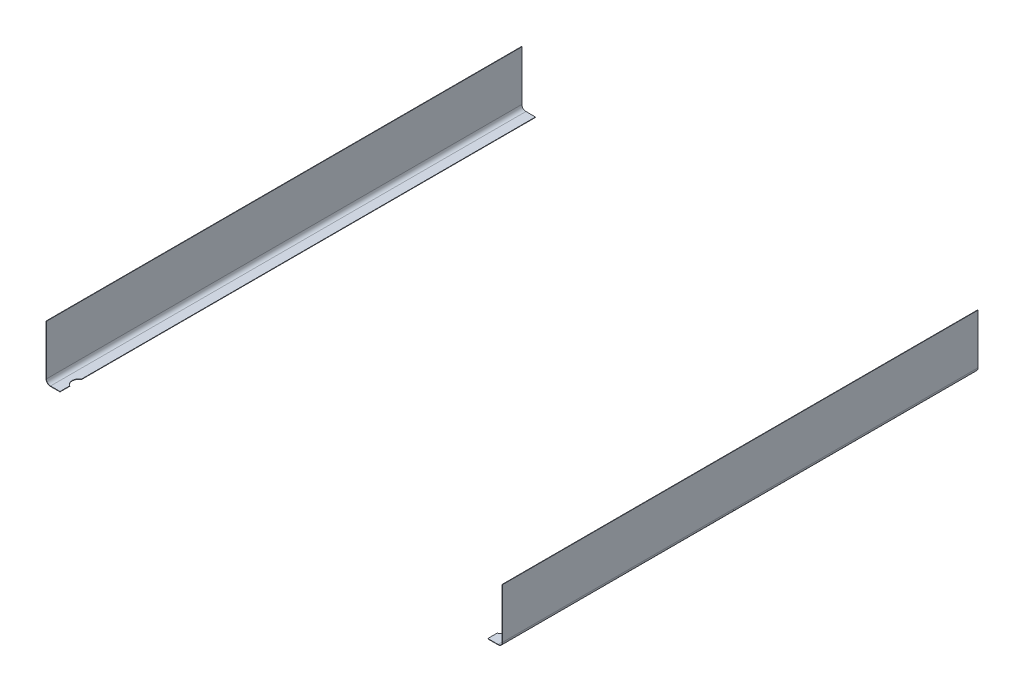
ISO-10303-21;
HEADER;
FILE_DESCRIPTION(('STEP AP214'),'2;1');
FILE_NAME('part.step','',(''),(''),'','','');
FILE_SCHEMA(('AUTOMOTIVE_DESIGN { 1 0 10303 214 1 1 1 1 }'));
ENDSEC;
DATA;
#1=APPLICATION_CONTEXT('core data for automotive mechanical design processes');
#2=APPLICATION_PROTOCOL_DEFINITION('international standard','automotive_design',2000,#1);
#3=PRODUCT_CONTEXT('',#1,'mechanical');
#4=PRODUCT('Part','Part','',(#3));
#5=PRODUCT_RELATED_PRODUCT_CATEGORY('part','',(#4));
#6=PRODUCT_DEFINITION_FORMATION('','',#4);
#7=PRODUCT_DEFINITION_CONTEXT('part definition',#1,'design');
#8=PRODUCT_DEFINITION('design','',#6,#7);
#9=PRODUCT_DEFINITION_SHAPE('','',#8);
#10=(LENGTH_UNIT() NAMED_UNIT(*) SI_UNIT(.MILLI.,.METRE.));
#11=(NAMED_UNIT(*) PLANE_ANGLE_UNIT() SI_UNIT($,.RADIAN.));
#12=(NAMED_UNIT(*) SI_UNIT($,.STERADIAN.) SOLID_ANGLE_UNIT());
#13=UNCERTAINTY_MEASURE_WITH_UNIT(LENGTH_MEASURE(1.E-05),#10,'distance_accuracy_value','');
#14=(GEOMETRIC_REPRESENTATION_CONTEXT(3) GLOBAL_UNCERTAINTY_ASSIGNED_CONTEXT((#13)) GLOBAL_UNIT_ASSIGNED_CONTEXT((#10,
#11,#12)) REPRESENTATION_CONTEXT('',''));
#15=CARTESIAN_POINT('',(0.,0.,0.));
#16=DIRECTION('',(0.,0.,1.));
#17=DIRECTION('',(1.,0.,0.));
#18=AXIS2_PLACEMENT_3D('',#15,#16,#17);
#19=CARTESIAN_POINT('',(-400.04999999999,100.838,-424.18762));
#20=DIRECTION('',(-1.,0.,0.));
#21=DIRECTION('',(0.,0.,1.));
#22=AXIS2_PLACEMENT_3D('',#19,#20,#21);
#23=PLANE('',#22);
#24=DIRECTION('',(0.,-1.,0.));
#25=VECTOR('',#24,1.);
#26=CARTESIAN_POINT('',(-400.04999999999,100.838,463.55));
#27=LINE('',#26,#25);
#28=CARTESIAN_POINT('',(-400.04999999999,0.,463.55));
#29=VERTEX_POINT('',#28);
#30=CARTESIAN_POINT('',(-400.04999999999,-0.762,463.55));
#31=VERTEX_POINT('',#30);
#32=EDGE_CURVE('P0_E235',#29,#31,#27,.T.);
#33=ORIENTED_EDGE('',*,*,#32,.T.);
#34=DIRECTION('',(0.,0.,-1.));
#35=VECTOR('',#34,1.);
#36=CARTESIAN_POINT('',(-400.04999999999,-0.762,-424.18762));
#37=LINE('',#36,#35);
#38=CARTESIAN_POINT('',(-400.04999999999,-0.762,445.338522628068));
#39=VERTEX_POINT('',#38);
#40=EDGE_CURVE('P0_E25',#31,#39,#37,.T.);
#41=ORIENTED_EDGE('',*,*,#40,.T.);
#42=DIRECTION('',(0.,-1.,0.));
#43=VECTOR('',#42,1.);
#44=CARTESIAN_POINT('',(-400.04999999999,0.508,445.338522628068));
#45=LINE('',#44,#43);
#46=CARTESIAN_POINT('',(-400.04999999999,0.,445.338522628068));
#47=VERTEX_POINT('',#46);
#48=EDGE_CURVE('P0_E231',#47,#39,#45,.T.);
#49=ORIENTED_EDGE('',*,*,#48,.F.);
#50=DIRECTION('',(0.,0.,-1.));
#51=VECTOR('',#50,1.);
#52=CARTESIAN_POINT('',(-400.04999999999,0.,0.));
#53=LINE('',#52,#51);
#54=EDGE_CURVE('P0_E48',#29,#47,#53,.T.);
#55=ORIENTED_EDGE('',*,*,#54,.F.);
#56=EDGE_LOOP('',(#33,#41,#49,#55));
#57=FACE_BOUND('',#56,.T.);
#58=ADVANCED_FACE('P0_F17',(#57),#23,.F.);
#59=CARTESIAN_POINT('',(-400.04999999999,100.838,-424.18762));
#60=DIRECTION('',(-1.,0.,0.));
#61=DIRECTION('',(0.,0.,1.));
#62=AXIS2_PLACEMENT_3D('',#59,#60,#61);
#63=PLANE('',#62);
#64=DIRECTION('',(0.,1.,0.));
#65=VECTOR('',#64,1.);
#66=CARTESIAN_POINT('',(-400.04999999999,0.508,423.341477371931));
#67=LINE('',#66,#65);
#68=CARTESIAN_POINT('',(-400.04999999999,-0.762,423.341477371931));
#69=VERTEX_POINT('',#68);
#70=CARTESIAN_POINT('',(-400.04999999999,0.,423.341477371931));
#71=VERTEX_POINT('',#70);
#72=EDGE_CURVE('P0_E223',#69,#71,#67,.T.);
#73=ORIENTED_EDGE('',*,*,#72,.F.);
#74=DIRECTION('',(0.,0.,-1.));
#75=VECTOR('',#74,1.);
#76=CARTESIAN_POINT('',(-400.04999999999,-0.762,-424.18762));
#77=LINE('',#76,#75);
#78=CARTESIAN_POINT('',(-400.04999999999,-0.762,-424.18762));
#79=VERTEX_POINT('',#78);
#80=EDGE_CURVE('P0_E11',#69,#79,#77,.T.);
#81=ORIENTED_EDGE('',*,*,#80,.T.);
#82=DIRECTION('',(0.,-1.,0.));
#83=VECTOR('',#82,1.);
#84=CARTESIAN_POINT('',(-400.04999999999,0.508,-424.18762));
#85=LINE('',#84,#83);
#86=CARTESIAN_POINT('',(-400.04999999999,0.,-424.18762));
#87=VERTEX_POINT('',#86);
#88=EDGE_CURVE('P0_E211',#87,#79,#85,.T.);
#89=ORIENTED_EDGE('',*,*,#88,.F.);
#90=DIRECTION('',(0.,0.,-1.));
#91=VECTOR('',#90,1.);
#92=CARTESIAN_POINT('',(-400.04999999999,0.,0.));
#93=LINE('',#92,#91);
#94=EDGE_CURVE('P0_E246',#71,#87,#93,.T.);
#95=ORIENTED_EDGE('',*,*,#94,.F.);
#96=EDGE_LOOP('',(#73,#81,#89,#95));
#97=FACE_BOUND('',#96,.T.);
#98=ADVANCED_FACE('P0_F259',(#97),#63,.F.);
#99=CARTESIAN_POINT('',(0.,-0.762,0.));
#100=DIRECTION('',(0.,-1.,0.));
#101=DIRECTION('',(0.,0.,-1.));
#102=AXIS2_PLACEMENT_3D('',#99,#100,#101);
#103=PLANE('',#102);
#104=ORIENTED_EDGE('',*,*,#40,.F.);
#105=DIRECTION('',(1.,0.,0.));
#106=VECTOR('',#105,1.);
#107=CARTESIAN_POINT('',(-426.212,-0.762,463.55));
#108=LINE('',#107,#106);
#109=CARTESIAN_POINT('',(-417.83,-0.762,463.55));
#110=VERTEX_POINT('',#109);
#111=EDGE_CURVE('P0_E241',#110,#31,#108,.T.);
#112=ORIENTED_EDGE('',*,*,#111,.F.);
#113=DIRECTION('',(0.,0.,1.));
#114=VECTOR('',#113,1.);
#115=CARTESIAN_POINT('',(-417.83,-0.762,-450.85));
#116=LINE('',#115,#114);
#117=CARTESIAN_POINT('',(-417.83,-0.762,-424.18762));
#118=VERTEX_POINT('',#117);
#119=EDGE_CURVE('P0_E141',#118,#110,#116,.T.);
#120=ORIENTED_EDGE('',*,*,#119,.F.);
#121=DIRECTION('',(1.,0.,0.));
#122=VECTOR('',#121,1.);
#123=CARTESIAN_POINT('',(0.,-0.762,-424.18762));
#124=LINE('',#123,#122);
#125=EDGE_CURVE('P0_E215',#118,#79,#124,.T.);
#126=ORIENTED_EDGE('',*,*,#125,.T.);
#127=ORIENTED_EDGE('',*,*,#80,.F.);
#128=CARTESIAN_POINT('',(-393.7,-0.762,434.34));
#129=DIRECTION('',(0.,-1.,0.));
#130=DIRECTION('',(0.,0.,-1.));
#131=AXIS2_PLACEMENT_3D('',#128,#129,#130);
#132=CIRCLE('',#131,12.7);
#133=EDGE_CURVE('P0_E219',#39,#69,#132,.T.);
#134=ORIENTED_EDGE('',*,*,#133,.F.);
#135=EDGE_LOOP('',(#104,#112,#120,#126,#127,#134));
#136=FACE_BOUND('',#135,.T.);
#137=ADVANCED_FACE('P0_F255',(#136),#103,.T.);
#138=CARTESIAN_POINT('',(0.,0.,0.));
#139=DIRECTION('',(0.,-1.,0.));
#140=DIRECTION('',(0.,0.,-1.));
#141=AXIS2_PLACEMENT_3D('',#138,#139,#140);
#142=PLANE('',#141);
#143=DIRECTION('',(1.,0.,0.));
#144=VECTOR('',#143,1.);
#145=CARTESIAN_POINT('',(-426.212,0.,463.55));
#146=LINE('',#145,#144);
#147=CARTESIAN_POINT('',(-417.83,0.,463.55));
#148=VERTEX_POINT('',#147);
#149=EDGE_CURVE('P0_E238',#148,#29,#146,.T.);
#150=ORIENTED_EDGE('',*,*,#149,.T.);
#151=ORIENTED_EDGE('',*,*,#54,.T.);
#152=CARTESIAN_POINT('',(-393.7,0.,434.34));
#153=DIRECTION('',(0.,-1.,0.));
#154=DIRECTION('',(0.,0.,-1.));
#155=AXIS2_PLACEMENT_3D('',#152,#153,#154);
#156=CIRCLE('',#155,12.7);
#157=EDGE_CURVE('P0_E227',#47,#71,#156,.T.);
#158=ORIENTED_EDGE('',*,*,#157,.T.);
#159=ORIENTED_EDGE('',*,*,#94,.T.);
#160=DIRECTION('',(1.,0.,0.));
#161=VECTOR('',#160,1.);
#162=CARTESIAN_POINT('',(0.,0.,-424.18762));
#163=LINE('',#162,#161);
#164=CARTESIAN_POINT('',(-417.83,0.,-424.18762));
#165=VERTEX_POINT('',#164);
#166=EDGE_CURVE('P0_E207',#165,#87,#163,.T.);
#167=ORIENTED_EDGE('',*,*,#166,.F.);
#168=DIRECTION('',(0.,0.,1.));
#169=VECTOR('',#168,1.);
#170=CARTESIAN_POINT('',(-417.83,0.,-450.85));
#171=LINE('',#170,#169);
#172=EDGE_CURVE('P0_E176',#165,#148,#171,.T.);
#173=ORIENTED_EDGE('',*,*,#172,.T.);
#174=EDGE_LOOP('',(#150,#151,#158,#159,#167,#173));
#175=FACE_BOUND('',#174,.T.);
#176=ADVANCED_FACE('P0_F261',(#175),#142,.F.);
#177=CARTESIAN_POINT('',(-426.212,-0.762,463.55));
#178=DIRECTION('',(0.,0.,1.));
#179=DIRECTION('',(1.,0.,0.));
#180=AXIS2_PLACEMENT_3D('',#177,#178,#179);
#181=PLANE('',#180);
#182=ORIENTED_EDGE('',*,*,#32,.F.);
#183=ORIENTED_EDGE('',*,*,#149,.F.);
#184=DIRECTION('',(0.,1.,0.));
#185=VECTOR('',#184,1.);
#186=CARTESIAN_POINT('',(-417.83,0.,463.55));
#187=LINE('',#186,#185);
#188=EDGE_CURVE('P0_E146',#110,#148,#187,.T.);
#189=ORIENTED_EDGE('',*,*,#188,.F.);
#190=ORIENTED_EDGE('',*,*,#111,.T.);
#191=EDGE_LOOP('',(#182,#183,#189,#190));
#192=FACE_BOUND('',#191,.T.);
#193=ADVANCED_FACE('P0_F264',(#192),#181,.T.);
#194=CARTESIAN_POINT('',(-393.7,0.508,434.34));
#195=DIRECTION('',(0.,-1.,0.));
#196=DIRECTION('',(0.,0.,-1.));
#197=AXIS2_PLACEMENT_3D('',#194,#195,#196);
#198=CYLINDRICAL_SURFACE('',#197,12.7);
#199=ORIENTED_EDGE('',*,*,#133,.T.);
#200=ORIENTED_EDGE('',*,*,#72,.T.);
#201=ORIENTED_EDGE('',*,*,#157,.F.);
#202=ORIENTED_EDGE('',*,*,#48,.T.);
#203=EDGE_LOOP('',(#199,#200,#201,#202));
#204=FACE_BOUND('',#203,.T.);
#205=ADVANCED_FACE('P0_F254',(#204),#198,.F.);
#206=CARTESIAN_POINT('',(-444.5,-103.378,-424.18762));
#207=DIRECTION('',(0.,0.,-1.));
#208=DIRECTION('',(0.,-1.,0.));
#209=AXIS2_PLACEMENT_3D('',#206,#207,#208);
#210=PLANE('',#209);
#211=DIRECTION('',(0.,1.,0.));
#212=VECTOR('',#211,1.);
#213=CARTESIAN_POINT('',(-425.45,0.,-424.18762));
#214=LINE('',#213,#212);
#215=CARTESIAN_POINT('',(-425.45,7.62,-424.18762));
#216=VERTEX_POINT('',#215);
#217=CARTESIAN_POINT('',(-425.45,100.838,-424.18762));
#218=VERTEX_POINT('',#217);
#219=EDGE_CURVE('P0_E204',#216,#218,#214,.T.);
#220=ORIENTED_EDGE('',*,*,#219,.F.);
#221=CARTESIAN_POINT('',(-417.83,7.62,-424.18762));
#222=DIRECTION('',(0.,0.,-1.));
#223=DIRECTION('',(-1.,0.,0.));
#224=AXIS2_PLACEMENT_3D('',#221,#222,#223);
#225=CIRCLE('',#224,7.62);
#226=EDGE_CURVE('P0_E172',#165,#216,#225,.T.);
#227=ORIENTED_EDGE('',*,*,#226,.F.);
#228=ORIENTED_EDGE('',*,*,#166,.T.);
#229=ORIENTED_EDGE('',*,*,#88,.T.);
#230=ORIENTED_EDGE('',*,*,#125,.F.);
#231=CARTESIAN_POINT('',(-417.83,7.62,-424.18762));
#232=DIRECTION('',(0.,0.,-1.));
#233=DIRECTION('',(-1.,0.,0.));
#234=AXIS2_PLACEMENT_3D('',#231,#232,#233);
#235=CIRCLE('',#234,8.382);
#236=CARTESIAN_POINT('',(-426.212,7.62,-424.18762));
#237=VERTEX_POINT('',#236);
#238=EDGE_CURVE('P0_E133',#118,#237,#235,.T.);
#239=ORIENTED_EDGE('',*,*,#238,.T.);
#240=DIRECTION('',(0.,1.,0.));
#241=VECTOR('',#240,1.);
#242=CARTESIAN_POINT('',(-426.212,0.,-424.18762));
#243=LINE('',#242,#241);
#244=CARTESIAN_POINT('',(-426.212,100.838,-424.18762));
#245=VERTEX_POINT('',#244);
#246=EDGE_CURVE('P0_E129',#237,#245,#243,.T.);
#247=ORIENTED_EDGE('',*,*,#246,.T.);
#248=DIRECTION('',(-1.,0.,0.));
#249=VECTOR('',#248,1.);
#250=CARTESIAN_POINT('',(-425.45,100.838,-424.18762));
#251=LINE('',#250,#249);
#252=EDGE_CURVE('P0_E189',#218,#245,#251,.T.);
#253=ORIENTED_EDGE('',*,*,#252,.F.);
#254=EDGE_LOOP('',(#220,#227,#228,#229,#230,#239,#247,#253));
#255=FACE_BOUND('',#254,.T.);
#256=ADVANCED_FACE('P0_F266',(#255),#210,.T.);
#257=CARTESIAN_POINT('',(-425.45,0.,-450.85));
#258=DIRECTION('',(1.,0.,0.));
#259=DIRECTION('',(0.,1.,0.));
#260=AXIS2_PLACEMENT_3D('',#257,#258,#259);
#261=PLANE('',#260);
#262=DIRECTION('',(0.,0.,1.));
#263=VECTOR('',#262,1.);
#264=CARTESIAN_POINT('',(-425.45,7.62,-450.85));
#265=LINE('',#264,#263);
#266=CARTESIAN_POINT('',(-425.45,7.62,463.55));
#267=VERTEX_POINT('',#266);
#268=EDGE_CURVE('P0_E175',#216,#267,#265,.T.);
#269=ORIENTED_EDGE('',*,*,#268,.F.);
#270=ORIENTED_EDGE('',*,*,#219,.T.);
#271=DIRECTION('',(0.,0.,1.));
#272=VECTOR('',#271,1.);
#273=CARTESIAN_POINT('',(-425.45,100.838,-450.85));
#274=LINE('',#273,#272);
#275=CARTESIAN_POINT('',(-425.45,100.838,463.55));
#276=VERTEX_POINT('',#275);
#277=EDGE_CURVE('P0_E170',#218,#276,#274,.T.);
#278=ORIENTED_EDGE('',*,*,#277,.T.);
#279=DIRECTION('',(0.,1.,0.));
#280=VECTOR('',#279,1.);
#281=CARTESIAN_POINT('',(-425.45,0.,463.55));
#282=LINE('',#281,#280);
#283=EDGE_CURVE('P0_E159',#267,#276,#282,.T.);
#284=ORIENTED_EDGE('',*,*,#283,.F.);
#285=EDGE_LOOP('',(#269,#270,#278,#284));
#286=FACE_BOUND('',#285,.T.);
#287=ADVANCED_FACE('P0_F273',(#286),#261,.T.);
#288=CARTESIAN_POINT('',(-417.83,7.62,-450.85));
#289=DIRECTION('',(0.,0.,1.));
#290=DIRECTION('',(1.,0.,0.));
#291=AXIS2_PLACEMENT_3D('',#288,#289,#290);
#292=CYLINDRICAL_SURFACE('',#291,7.62);
#293=ORIENTED_EDGE('',*,*,#172,.F.);
#294=ORIENTED_EDGE('',*,*,#226,.T.);
#295=ORIENTED_EDGE('',*,*,#268,.T.);
#296=CARTESIAN_POINT('',(-417.83,7.62,463.55));
#297=DIRECTION('',(0.,0.,-1.));
#298=DIRECTION('',(1.,0.,0.));
#299=AXIS2_PLACEMENT_3D('',#296,#297,#298);
#300=CIRCLE('',#299,7.62);
#301=EDGE_CURVE('P0_E154',#148,#267,#300,.T.);
#302=ORIENTED_EDGE('',*,*,#301,.F.);
#303=EDGE_LOOP('',(#293,#294,#295,#302));
#304=FACE_BOUND('',#303,.T.);
#305=ADVANCED_FACE('P0_F271',(#304),#292,.F.);
#306=CARTESIAN_POINT('',(-417.83,7.62,-450.85));
#307=DIRECTION('',(0.,0.,1.));
#308=DIRECTION('',(1.,0.,0.));
#309=AXIS2_PLACEMENT_3D('',#306,#307,#308);
#310=CYLINDRICAL_SURFACE('',#309,8.382);
#311=ORIENTED_EDGE('',*,*,#238,.F.);
#312=ORIENTED_EDGE('',*,*,#119,.T.);
#313=CARTESIAN_POINT('',(-417.83,7.62,463.55));
#314=DIRECTION('',(0.,0.,-1.));
#315=DIRECTION('',(1.,0.,0.));
#316=AXIS2_PLACEMENT_3D('',#313,#314,#315);
#317=CIRCLE('',#316,8.382);
#318=CARTESIAN_POINT('',(-426.212,7.62,463.55));
#319=VERTEX_POINT('',#318);
#320=EDGE_CURVE('P0_E137',#110,#319,#317,.T.);
#321=ORIENTED_EDGE('',*,*,#320,.T.);
#322=DIRECTION('',(0.,0.,1.));
#323=VECTOR('',#322,1.);
#324=CARTESIAN_POINT('',(-426.212,7.62,-450.85));
#325=LINE('',#324,#323);
#326=EDGE_CURVE('P0_E123',#237,#319,#325,.T.);
#327=ORIENTED_EDGE('',*,*,#326,.F.);
#328=EDGE_LOOP('',(#311,#312,#321,#327));
#329=FACE_BOUND('',#328,.T.);
#330=ADVANCED_FACE('P0_F139',(#329),#310,.T.);
#331=CARTESIAN_POINT('',(-426.212,0.,-450.85));
#332=DIRECTION('',(1.,0.,0.));
#333=DIRECTION('',(0.,1.,0.));
#334=AXIS2_PLACEMENT_3D('',#331,#332,#333);
#335=PLANE('',#334);
#336=ORIENTED_EDGE('',*,*,#246,.F.);
#337=ORIENTED_EDGE('',*,*,#326,.T.);
#338=DIRECTION('',(0.,1.,0.));
#339=VECTOR('',#338,1.);
#340=CARTESIAN_POINT('',(-426.212,0.,463.55));
#341=LINE('',#340,#339);
#342=CARTESIAN_POINT('',(-426.212,100.838,463.55));
#343=VERTEX_POINT('',#342);
#344=EDGE_CURVE('P0_E128',#319,#343,#341,.T.);
#345=ORIENTED_EDGE('',*,*,#344,.T.);
#346=DIRECTION('',(0.,0.,1.));
#347=VECTOR('',#346,1.);
#348=CARTESIAN_POINT('',(-426.212,100.838,-450.85));
#349=LINE('',#348,#347);
#350=EDGE_CURVE('P0_E193',#245,#343,#349,.T.);
#351=ORIENTED_EDGE('',*,*,#350,.F.);
#352=EDGE_LOOP('',(#336,#337,#345,#351));
#353=FACE_BOUND('',#352,.T.);
#354=ADVANCED_FACE('P0_F125',(#353),#335,.F.);
#355=CARTESIAN_POINT('',(-425.45,100.838,-450.85));
#356=DIRECTION('',(0.,1.,0.));
#357=DIRECTION('',(1.,0.,0.));
#358=AXIS2_PLACEMENT_3D('',#355,#356,#357);
#359=PLANE('',#358);
#360=ORIENTED_EDGE('',*,*,#277,.F.);
#361=ORIENTED_EDGE('',*,*,#252,.T.);
#362=ORIENTED_EDGE('',*,*,#350,.T.);
#363=DIRECTION('',(1.,0.,0.));
#364=VECTOR('',#363,1.);
#365=CARTESIAN_POINT('',(-425.45,100.838,463.55));
#366=LINE('',#365,#364);
#367=EDGE_CURVE('P0_E147',#343,#276,#366,.T.);
#368=ORIENTED_EDGE('',*,*,#367,.T.);
#369=EDGE_LOOP('',(#360,#361,#362,#368));
#370=FACE_BOUND('',#369,.T.);
#371=ADVANCED_FACE('P0_F277',(#370),#359,.T.);
#372=CARTESIAN_POINT('',(-417.83,7.62,463.55));
#373=DIRECTION('',(0.,0.,-1.));
#374=DIRECTION('',(0.,-1.,0.));
#375=AXIS2_PLACEMENT_3D('',#372,#373,#374);
#376=PLANE('',#375);
#377=DIRECTION('',(1.,0.,0.));
#378=VECTOR('',#377,1.);
#379=CARTESIAN_POINT('',(-425.45,7.62,463.55));
#380=LINE('',#379,#378);
#381=EDGE_CURVE('P0_E151',#319,#267,#380,.T.);
#382=ORIENTED_EDGE('',*,*,#381,.F.);
#383=ORIENTED_EDGE('',*,*,#320,.F.);
#384=ORIENTED_EDGE('',*,*,#188,.T.);
#385=ORIENTED_EDGE('',*,*,#301,.T.);
#386=EDGE_LOOP('',(#382,#383,#384,#385));
#387=FACE_BOUND('',#386,.T.);
#388=ADVANCED_FACE('P0_F152',(#387),#376,.F.);
#389=CARTESIAN_POINT('',(-425.45,0.,463.55));
#390=DIRECTION('',(0.,0.,-1.));
#391=DIRECTION('',(0.,-1.,0.));
#392=AXIS2_PLACEMENT_3D('',#389,#390,#391);
#393=PLANE('',#392);
#394=ORIENTED_EDGE('',*,*,#344,.F.);
#395=ORIENTED_EDGE('',*,*,#381,.T.);
#396=ORIENTED_EDGE('',*,*,#283,.T.);
#397=ORIENTED_EDGE('',*,*,#367,.F.);
#398=EDGE_LOOP('',(#394,#395,#396,#397));
#399=FACE_BOUND('',#398,.T.);
#400=ADVANCED_FACE('P0_F162',(#399),#393,.F.);
#401=CLOSED_SHELL('',(#58,#98,#137,#176,#193,#205,#256,#287,#305,#330,#354,#371,#388,#400));
#402=MANIFOLD_SOLID_BREP('P0_B1',#401);
#403=CARTESIAN_POINT('',(398.78000000001,100.838,-424.18762));
#404=DIRECTION('',(1.,0.,0.));
#405=DIRECTION('',(0.,1.,0.));
#406=AXIS2_PLACEMENT_3D('',#403,#404,#405);
#407=PLANE('',#406);
#408=DIRECTION('',(0.,1.,0.));
#409=VECTOR('',#408,1.);
#410=CARTESIAN_POINT('',(398.78000000001,0.508,445.979742265184));
#411=LINE('',#410,#409);
#412=CARTESIAN_POINT('',(398.78000000001,-0.762,445.979742265184));
#413=VERTEX_POINT('',#412);
#414=CARTESIAN_POINT('',(398.78000000001,0.,445.979742265184));
#415=VERTEX_POINT('',#414);
#416=EDGE_CURVE('P1_E49',#413,#415,#411,.T.);
#417=ORIENTED_EDGE('',*,*,#416,.F.);
#418=DIRECTION('',(0.,0.,1.));
#419=VECTOR('',#418,1.);
#420=CARTESIAN_POINT('',(398.78000000001,-0.762,-424.18762));
#421=LINE('',#420,#419);
#422=CARTESIAN_POINT('',(398.78000000001,-0.762,463.55));
#423=VERTEX_POINT('',#422);
#424=EDGE_CURVE('P1_E204',#413,#423,#421,.T.);
#425=ORIENTED_EDGE('',*,*,#424,.T.);
#426=DIRECTION('',(0.,-1.,0.));
#427=VECTOR('',#426,1.);
#428=CARTESIAN_POINT('',(398.78000000001,100.838,463.55));
#429=LINE('',#428,#427);
#430=CARTESIAN_POINT('',(398.78000000001,0.,463.55));
#431=VERTEX_POINT('',#430);
#432=EDGE_CURVE('P1_E38',#431,#423,#429,.T.);
#433=ORIENTED_EDGE('',*,*,#432,.F.);
#434=DIRECTION('',(0.,0.,1.));
#435=VECTOR('',#434,1.);
#436=CARTESIAN_POINT('',(398.78000000001,0.,0.));
#437=LINE('',#436,#435);
#438=EDGE_CURVE('P1_E222',#415,#431,#437,.T.);
#439=ORIENTED_EDGE('',*,*,#438,.F.);
#440=EDGE_LOOP('',(#417,#425,#433,#439));
#441=FACE_BOUND('',#440,.T.);
#442=ADVANCED_FACE('P1_F17',(#441),#407,.F.);
#443=CARTESIAN_POINT('',(398.78000000001,100.838,-424.18762));
#444=DIRECTION('',(1.,0.,0.));
#445=DIRECTION('',(0.,1.,0.));
#446=AXIS2_PLACEMENT_3D('',#443,#444,#445);
#447=PLANE('',#446);
#448=DIRECTION('',(0.,1.,0.));
#449=VECTOR('',#448,1.);
#450=CARTESIAN_POINT('',(398.78000000001,0.508,-424.18762));
#451=LINE('',#450,#449);
#452=CARTESIAN_POINT('',(398.78000000001,-0.762,-424.18762));
#453=VERTEX_POINT('',#452);
#454=CARTESIAN_POINT('',(398.78000000001,0.,-424.18762));
#455=VERTEX_POINT('',#454);
#456=EDGE_CURVE('P1_E11',#453,#455,#451,.T.);
#457=ORIENTED_EDGE('',*,*,#456,.F.);
#458=DIRECTION('',(0.,0.,1.));
#459=VECTOR('',#458,1.);
#460=CARTESIAN_POINT('',(398.78000000001,-0.762,-424.18762));
#461=LINE('',#460,#459);
#462=CARTESIAN_POINT('',(398.78000000001,-0.762,422.700257734816));
#463=VERTEX_POINT('',#462);
#464=EDGE_CURVE('P1_E170',#453,#463,#461,.T.);
#465=ORIENTED_EDGE('',*,*,#464,.T.);
#466=DIRECTION('',(0.,-1.,0.));
#467=VECTOR('',#466,1.);
#468=CARTESIAN_POINT('',(398.78000000001,0.508,422.700257734816));
#469=LINE('',#468,#467);
#470=CARTESIAN_POINT('',(398.78000000001,0.,422.700257734816));
#471=VERTEX_POINT('',#470);
#472=EDGE_CURVE('P1_E25',#471,#463,#469,.T.);
#473=ORIENTED_EDGE('',*,*,#472,.F.);
#474=DIRECTION('',(0.,0.,1.));
#475=VECTOR('',#474,1.);
#476=CARTESIAN_POINT('',(398.78000000001,0.,0.));
#477=LINE('',#476,#475);
#478=EDGE_CURVE('P1_E225',#455,#471,#477,.T.);
#479=ORIENTED_EDGE('',*,*,#478,.F.);
#480=EDGE_LOOP('',(#457,#465,#473,#479));
#481=FACE_BOUND('',#480,.T.);
#482=ADVANCED_FACE('P1_F253',(#481),#447,.F.);
#483=CARTESIAN_POINT('',(-444.5,-103.378,-424.18762));
#484=DIRECTION('',(0.,0.,-1.));
#485=DIRECTION('',(0.,-1.,0.));
#486=AXIS2_PLACEMENT_3D('',#483,#484,#485);
#487=PLANE('',#486);
#488=DIRECTION('',(0.,-1.,0.));
#489=VECTOR('',#488,1.);
#490=CARTESIAN_POINT('',(426.212,0.,-424.18762));
#491=LINE('',#490,#489);
#492=CARTESIAN_POINT('',(426.212,100.838,-424.18762));
#493=VERTEX_POINT('',#492);
#494=CARTESIAN_POINT('',(426.212,7.62,-424.18762));
#495=VERTEX_POINT('',#494);
#496=EDGE_CURVE('P1_E136',#493,#495,#491,.T.);
#497=ORIENTED_EDGE('',*,*,#496,.T.);
#498=CARTESIAN_POINT('',(417.83,7.62,-424.18762));
#499=DIRECTION('',(0.,0.,-1.));
#500=DIRECTION('',(-1.,0.,0.));
#501=AXIS2_PLACEMENT_3D('',#498,#499,#500);
#502=CIRCLE('',#501,8.382);
#503=CARTESIAN_POINT('',(417.83,-0.762,-424.18762));
#504=VERTEX_POINT('',#503);
#505=EDGE_CURVE('P1_E160',#495,#504,#502,.T.);
#506=ORIENTED_EDGE('',*,*,#505,.T.);
#507=DIRECTION('',(1.,0.,0.));
#508=VECTOR('',#507,1.);
#509=CARTESIAN_POINT('',(0.,-0.762,-424.18762));
#510=LINE('',#509,#508);
#511=EDGE_CURVE('P1_E210',#453,#504,#510,.T.);
#512=ORIENTED_EDGE('',*,*,#511,.F.);
#513=ORIENTED_EDGE('',*,*,#456,.T.);
#514=DIRECTION('',(1.,0.,0.));
#515=VECTOR('',#514,1.);
#516=CARTESIAN_POINT('',(0.,0.,-424.18762));
#517=LINE('',#516,#515);
#518=CARTESIAN_POINT('',(417.83,0.,-424.18762));
#519=VERTEX_POINT('',#518);
#520=EDGE_CURVE('P1_E203',#455,#519,#517,.T.);
#521=ORIENTED_EDGE('',*,*,#520,.T.);
#522=CARTESIAN_POINT('',(417.83,7.62,-424.18762));
#523=DIRECTION('',(0.,0.,-1.));
#524=DIRECTION('',(-1.,0.,0.));
#525=AXIS2_PLACEMENT_3D('',#522,#523,#524);
#526=CIRCLE('',#525,7.62);
#527=CARTESIAN_POINT('',(425.45,7.62,-424.18762));
#528=VERTEX_POINT('',#527);
#529=EDGE_CURVE('P1_E186',#528,#519,#526,.T.);
#530=ORIENTED_EDGE('',*,*,#529,.F.);
#531=DIRECTION('',(0.,-1.,0.));
#532=VECTOR('',#531,1.);
#533=CARTESIAN_POINT('',(425.45,0.,-424.18762));
#534=LINE('',#533,#532);
#535=CARTESIAN_POINT('',(425.45,100.838,-424.18762));
#536=VERTEX_POINT('',#535);
#537=EDGE_CURVE('P1_E146',#536,#528,#534,.T.);
#538=ORIENTED_EDGE('',*,*,#537,.F.);
#539=DIRECTION('',(-1.,0.,0.));
#540=VECTOR('',#539,1.);
#541=CARTESIAN_POINT('',(425.45,100.838,-424.18762));
#542=LINE('',#541,#540);
#543=EDGE_CURVE('P1_E152',#493,#536,#542,.T.);
#544=ORIENTED_EDGE('',*,*,#543,.F.);
#545=EDGE_LOOP('',(#497,#506,#512,#513,#521,#530,#538,#544));
#546=FACE_BOUND('',#545,.T.);
#547=ADVANCED_FACE('P1_F258',(#546),#487,.T.);
#548=CARTESIAN_POINT('',(393.7,0.508,434.34));
#549=DIRECTION('',(0.,-1.,0.));
#550=DIRECTION('',(0.,0.,-1.));
#551=AXIS2_PLACEMENT_3D('',#548,#549,#550);
#552=CYLINDRICAL_SURFACE('',#551,12.7);
#553=CARTESIAN_POINT('',(393.7,-0.762,434.34));
#554=DIRECTION('',(0.,-1.,0.));
#555=DIRECTION('',(0.,0.,-1.));
#556=AXIS2_PLACEMENT_3D('',#553,#554,#555);
#557=CIRCLE('',#556,12.7);
#558=EDGE_CURVE('P1_E200',#463,#413,#557,.T.);
#559=ORIENTED_EDGE('',*,*,#558,.T.);
#560=ORIENTED_EDGE('',*,*,#416,.T.);
#561=CARTESIAN_POINT('',(393.7,0.,434.34));
#562=DIRECTION('',(0.,-1.,0.));
#563=DIRECTION('',(0.,0.,-1.));
#564=AXIS2_PLACEMENT_3D('',#561,#562,#563);
#565=CIRCLE('',#564,12.7);
#566=EDGE_CURVE('P1_E229',#471,#415,#565,.T.);
#567=ORIENTED_EDGE('',*,*,#566,.F.);
#568=ORIENTED_EDGE('',*,*,#472,.T.);
#569=EDGE_LOOP('',(#559,#560,#567,#568));
#570=FACE_BOUND('',#569,.T.);
#571=ADVANCED_FACE('P1_F245',(#570),#552,.F.);
#572=CARTESIAN_POINT('',(-426.212,-0.762,463.55));
#573=DIRECTION('',(0.,0.,1.));
#574=DIRECTION('',(1.,0.,0.));
#575=AXIS2_PLACEMENT_3D('',#572,#573,#574);
#576=PLANE('',#575);
#577=ORIENTED_EDGE('',*,*,#432,.T.);
#578=DIRECTION('',(1.,0.,0.));
#579=VECTOR('',#578,1.);
#580=CARTESIAN_POINT('',(-426.212,-0.762,463.55));
#581=LINE('',#580,#579);
#582=CARTESIAN_POINT('',(417.83,-0.762,463.55));
#583=VERTEX_POINT('',#582);
#584=EDGE_CURVE('P1_E213',#423,#583,#581,.T.);
#585=ORIENTED_EDGE('',*,*,#584,.T.);
#586=DIRECTION('',(0.,1.,0.));
#587=VECTOR('',#586,1.);
#588=CARTESIAN_POINT('',(417.83,0.,463.55));
#589=LINE('',#588,#587);
#590=CARTESIAN_POINT('',(417.83,0.,463.55));
#591=VERTEX_POINT('',#590);
#592=EDGE_CURVE('P1_E162',#583,#591,#589,.T.);
#593=ORIENTED_EDGE('',*,*,#592,.T.);
#594=DIRECTION('',(1.,0.,0.));
#595=VECTOR('',#594,1.);
#596=CARTESIAN_POINT('',(-426.212,0.,463.55));
#597=LINE('',#596,#595);
#598=EDGE_CURVE('P1_E165',#431,#591,#597,.T.);
#599=ORIENTED_EDGE('',*,*,#598,.F.);
#600=EDGE_LOOP('',(#577,#585,#593,#599));
#601=FACE_BOUND('',#600,.T.);
#602=ADVANCED_FACE('P1_F269',(#601),#576,.T.);
#603=CARTESIAN_POINT('',(425.45,0.,463.55));
#604=DIRECTION('',(0.,0.,1.));
#605=DIRECTION('',(1.,0.,0.));
#606=AXIS2_PLACEMENT_3D('',#603,#604,#605);
#607=PLANE('',#606);
#608=DIRECTION('',(-1.,0.,0.));
#609=VECTOR('',#608,1.);
#610=CARTESIAN_POINT('',(425.45,7.62,463.55));
#611=LINE('',#610,#609);
#612=CARTESIAN_POINT('',(426.212,7.62,463.55));
#613=VERTEX_POINT('',#612);
#614=CARTESIAN_POINT('',(425.45,7.62,463.55));
#615=VERTEX_POINT('',#614);
#616=EDGE_CURVE('P1_E129',#613,#615,#611,.T.);
#617=ORIENTED_EDGE('',*,*,#616,.F.);
#618=DIRECTION('',(0.,1.,0.));
#619=VECTOR('',#618,1.);
#620=CARTESIAN_POINT('',(426.212,0.,463.55));
#621=LINE('',#620,#619);
#622=CARTESIAN_POINT('',(426.212,100.838,463.55));
#623=VERTEX_POINT('',#622);
#624=EDGE_CURVE('P1_E123',#613,#623,#621,.T.);
#625=ORIENTED_EDGE('',*,*,#624,.T.);
#626=DIRECTION('',(-1.,0.,0.));
#627=VECTOR('',#626,1.);
#628=CARTESIAN_POINT('',(425.45,100.838,463.55));
#629=LINE('',#628,#627);
#630=CARTESIAN_POINT('',(425.45,100.838,463.55));
#631=VERTEX_POINT('',#630);
#632=EDGE_CURVE('P1_E127',#623,#631,#629,.T.);
#633=ORIENTED_EDGE('',*,*,#632,.T.);
#634=DIRECTION('',(0.,1.,0.));
#635=VECTOR('',#634,1.);
#636=CARTESIAN_POINT('',(425.45,0.,463.55));
#637=LINE('',#636,#635);
#638=EDGE_CURVE('P1_E183',#615,#631,#637,.T.);
#639=ORIENTED_EDGE('',*,*,#638,.F.);
#640=EDGE_LOOP('',(#617,#625,#633,#639));
#641=FACE_BOUND('',#640,.T.);
#642=ADVANCED_FACE('P1_F125',(#641),#607,.T.);
#643=CARTESIAN_POINT('',(417.83,7.62,463.55));
#644=DIRECTION('',(0.,0.,1.));
#645=DIRECTION('',(1.,0.,0.));
#646=AXIS2_PLACEMENT_3D('',#643,#644,#645);
#647=PLANE('',#646);
#648=ORIENTED_EDGE('',*,*,#592,.F.);
#649=CARTESIAN_POINT('',(417.83,7.62,463.55));
#650=DIRECTION('',(0.,0.,1.));
#651=DIRECTION('',(-1.,0.,0.));
#652=AXIS2_PLACEMENT_3D('',#649,#650,#651);
#653=CIRCLE('',#652,8.382);
#654=EDGE_CURVE('P1_E171',#583,#613,#653,.T.);
#655=ORIENTED_EDGE('',*,*,#654,.T.);
#656=ORIENTED_EDGE('',*,*,#616,.T.);
#657=CARTESIAN_POINT('',(417.83,7.62,463.55));
#658=DIRECTION('',(0.,0.,1.));
#659=DIRECTION('',(-1.,0.,0.));
#660=AXIS2_PLACEMENT_3D('',#657,#658,#659);
#661=CIRCLE('',#660,7.62);
#662=EDGE_CURVE('P1_E193',#591,#615,#661,.T.);
#663=ORIENTED_EDGE('',*,*,#662,.F.);
#664=EDGE_LOOP('',(#648,#655,#656,#663));
#665=FACE_BOUND('',#664,.T.);
#666=ADVANCED_FACE('P1_F265',(#665),#647,.T.);
#667=CARTESIAN_POINT('',(0.,0.,0.));
#668=DIRECTION('',(0.,-1.,0.));
#669=DIRECTION('',(0.,0.,-1.));
#670=AXIS2_PLACEMENT_3D('',#667,#668,#669);
#671=PLANE('',#670);
#672=ORIENTED_EDGE('',*,*,#520,.F.);
#673=ORIENTED_EDGE('',*,*,#478,.T.);
#674=ORIENTED_EDGE('',*,*,#566,.T.);
#675=ORIENTED_EDGE('',*,*,#438,.T.);
#676=ORIENTED_EDGE('',*,*,#598,.T.);
#677=DIRECTION('',(0.,0.,-1.));
#678=VECTOR('',#677,1.);
#679=CARTESIAN_POINT('',(417.83,0.,463.55));
#680=LINE('',#679,#678);
#681=EDGE_CURVE('P1_E190',#591,#519,#680,.T.);
#682=ORIENTED_EDGE('',*,*,#681,.T.);
#683=EDGE_LOOP('',(#672,#673,#674,#675,#676,#682));
#684=FACE_BOUND('',#683,.T.);
#685=ADVANCED_FACE('P1_F271',(#684),#671,.F.);
#686=CARTESIAN_POINT('',(0.,-0.762,0.));
#687=DIRECTION('',(0.,-1.,0.));
#688=DIRECTION('',(0.,0.,-1.));
#689=AXIS2_PLACEMENT_3D('',#686,#687,#688);
#690=PLANE('',#689);
#691=ORIENTED_EDGE('',*,*,#464,.F.);
#692=ORIENTED_EDGE('',*,*,#511,.T.);
#693=DIRECTION('',(0.,0.,-1.));
#694=VECTOR('',#693,1.);
#695=CARTESIAN_POINT('',(417.83,-0.762,463.55));
#696=LINE('',#695,#694);
#697=EDGE_CURVE('P1_E166',#583,#504,#696,.T.);
#698=ORIENTED_EDGE('',*,*,#697,.F.);
#699=ORIENTED_EDGE('',*,*,#584,.F.);
#700=ORIENTED_EDGE('',*,*,#424,.F.);
#701=ORIENTED_EDGE('',*,*,#558,.F.);
#702=EDGE_LOOP('',(#691,#692,#698,#699,#700,#701));
#703=FACE_BOUND('',#702,.T.);
#704=ADVANCED_FACE('P1_F251',(#703),#690,.T.);
#705=CARTESIAN_POINT('',(417.83,7.62,463.55));
#706=DIRECTION('',(0.,0.,-1.));
#707=DIRECTION('',(-1.,0.,0.));
#708=AXIS2_PLACEMENT_3D('',#705,#706,#707);
#709=CYLINDRICAL_SURFACE('',#708,8.382);
#710=ORIENTED_EDGE('',*,*,#505,.F.);
#711=DIRECTION('',(0.,0.,-1.));
#712=VECTOR('',#711,1.);
#713=CARTESIAN_POINT('',(426.212,7.62,463.55));
#714=LINE('',#713,#712);
#715=EDGE_CURVE('P1_E135',#613,#495,#714,.T.);
#716=ORIENTED_EDGE('',*,*,#715,.F.);
#717=ORIENTED_EDGE('',*,*,#654,.F.);
#718=ORIENTED_EDGE('',*,*,#697,.T.);
#719=EDGE_LOOP('',(#710,#716,#717,#718));
#720=FACE_BOUND('',#719,.T.);
#721=ADVANCED_FACE('P1_F262',(#720),#709,.T.);
#722=CARTESIAN_POINT('',(426.212,0.,463.55));
#723=DIRECTION('',(-1.,0.,0.));
#724=DIRECTION('',(0.,0.,1.));
#725=AXIS2_PLACEMENT_3D('',#722,#723,#724);
#726=PLANE('',#725);
#727=ORIENTED_EDGE('',*,*,#496,.F.);
#728=DIRECTION('',(0.,0.,-1.));
#729=VECTOR('',#728,1.);
#730=CARTESIAN_POINT('',(426.212,100.838,463.55));
#731=LINE('',#730,#729);
#732=EDGE_CURVE('P1_E142',#623,#493,#731,.T.);
#733=ORIENTED_EDGE('',*,*,#732,.F.);
#734=ORIENTED_EDGE('',*,*,#624,.F.);
#735=ORIENTED_EDGE('',*,*,#715,.T.);
#736=EDGE_LOOP('',(#727,#733,#734,#735));
#737=FACE_BOUND('',#736,.T.);
#738=ADVANCED_FACE('P1_F148',(#737),#726,.F.);
#739=CARTESIAN_POINT('',(417.83,7.62,463.55));
#740=DIRECTION('',(0.,0.,-1.));
#741=DIRECTION('',(-1.,0.,0.));
#742=AXIS2_PLACEMENT_3D('',#739,#740,#741);
#743=CYLINDRICAL_SURFACE('',#742,7.62);
#744=DIRECTION('',(0.,0.,-1.));
#745=VECTOR('',#744,1.);
#746=CARTESIAN_POINT('',(425.45,7.62,463.55));
#747=LINE('',#746,#745);
#748=EDGE_CURVE('P1_E179',#615,#528,#747,.T.);
#749=ORIENTED_EDGE('',*,*,#748,.T.);
#750=ORIENTED_EDGE('',*,*,#529,.T.);
#751=ORIENTED_EDGE('',*,*,#681,.F.);
#752=ORIENTED_EDGE('',*,*,#662,.T.);
#753=EDGE_LOOP('',(#749,#750,#751,#752));
#754=FACE_BOUND('',#753,.T.);
#755=ADVANCED_FACE('P1_F274',(#754),#743,.F.);
#756=CARTESIAN_POINT('',(425.45,0.,463.55));
#757=DIRECTION('',(-1.,0.,0.));
#758=DIRECTION('',(0.,0.,1.));
#759=AXIS2_PLACEMENT_3D('',#756,#757,#758);
#760=PLANE('',#759);
#761=DIRECTION('',(0.,0.,-1.));
#762=VECTOR('',#761,1.);
#763=CARTESIAN_POINT('',(425.45,100.838,463.55));
#764=LINE('',#763,#762);
#765=EDGE_CURVE('P1_E144',#631,#536,#764,.T.);
#766=ORIENTED_EDGE('',*,*,#765,.T.);
#767=ORIENTED_EDGE('',*,*,#537,.T.);
#768=ORIENTED_EDGE('',*,*,#748,.F.);
#769=ORIENTED_EDGE('',*,*,#638,.T.);
#770=EDGE_LOOP('',(#766,#767,#768,#769));
#771=FACE_BOUND('',#770,.T.);
#772=ADVANCED_FACE('P1_F276',(#771),#760,.T.);
#773=CARTESIAN_POINT('',(425.45,100.838,463.55));
#774=DIRECTION('',(0.,1.,0.));
#775=DIRECTION('',(1.,0.,0.));
#776=AXIS2_PLACEMENT_3D('',#773,#774,#775);
#777=PLANE('',#776);
#778=ORIENTED_EDGE('',*,*,#732,.T.);
#779=ORIENTED_EDGE('',*,*,#543,.T.);
#780=ORIENTED_EDGE('',*,*,#765,.F.);
#781=ORIENTED_EDGE('',*,*,#632,.F.);
#782=EDGE_LOOP('',(#778,#779,#780,#781));
#783=FACE_BOUND('',#782,.T.);
#784=ADVANCED_FACE('P1_F140',(#783),#777,.T.);
#785=CLOSED_SHELL('',(#442,#482,#547,#571,#602,#642,#666,#685,#704,#721,#738,#755,#772,#784));
#786=MANIFOLD_SOLID_BREP('P1_B1',#785);
#787=ADVANCED_BREP_SHAPE_REPRESENTATION('',(#18,#402,#786),#14);
#788=SHAPE_DEFINITION_REPRESENTATION(#9,#787);
ENDSEC;
END-ISO-10303-21;
